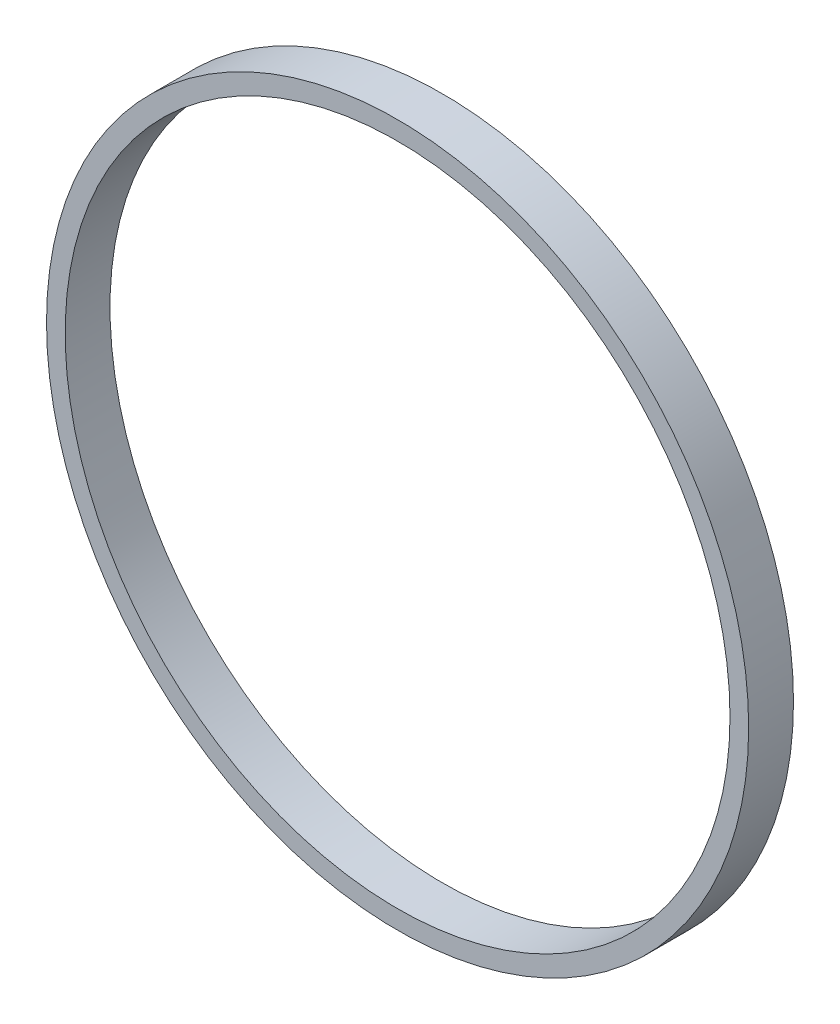
ISO-10303-21;
HEADER;
FILE_DESCRIPTION(('STEP AP214'),'2;1');
FILE_NAME('part.step','',(''),(''),'','','');
FILE_SCHEMA(('AUTOMOTIVE_DESIGN { 1 0 10303 214 1 1 1 1 }'));
ENDSEC;
DATA;
#1=APPLICATION_CONTEXT('core data for automotive mechanical design processes');
#2=APPLICATION_PROTOCOL_DEFINITION('international standard','automotive_design',2000,#1);
#3=PRODUCT_CONTEXT('',#1,'mechanical');
#4=PRODUCT('Part','Part','',(#3));
#5=PRODUCT_RELATED_PRODUCT_CATEGORY('part','',(#4));
#6=PRODUCT_DEFINITION_FORMATION('','',#4);
#7=PRODUCT_DEFINITION_CONTEXT('part definition',#1,'design');
#8=PRODUCT_DEFINITION('design','',#6,#7);
#9=PRODUCT_DEFINITION_SHAPE('','',#8);
#10=(LENGTH_UNIT() NAMED_UNIT(*) SI_UNIT(.MILLI.,.METRE.));
#11=(NAMED_UNIT(*) PLANE_ANGLE_UNIT() SI_UNIT($,.RADIAN.));
#12=(NAMED_UNIT(*) SI_UNIT($,.STERADIAN.) SOLID_ANGLE_UNIT());
#13=UNCERTAINTY_MEASURE_WITH_UNIT(LENGTH_MEASURE(1.E-05),#10,'distance_accuracy_value','');
#14=(GEOMETRIC_REPRESENTATION_CONTEXT(3) GLOBAL_UNCERTAINTY_ASSIGNED_CONTEXT((#13)) GLOBAL_UNIT_ASSIGNED_CONTEXT((#10,
#11,#12)) REPRESENTATION_CONTEXT('',''));
#15=CARTESIAN_POINT('',(0.,0.,0.));
#16=DIRECTION('',(0.,0.,1.));
#17=DIRECTION('',(1.,0.,0.));
#18=AXIS2_PLACEMENT_3D('',#15,#16,#17);
#19=CARTESIAN_POINT('',(0.,0.,3.));
#20=DIRECTION('',(0.,0.,1.));
#21=DIRECTION('',(1.,0.,0.));
#22=AXIS2_PLACEMENT_3D('',#19,#20,#21);
#23=PLANE('',#22);
#24=CARTESIAN_POINT('',(0.,0.,3.));
#25=DIRECTION('',(0.,0.,1.));
#26=DIRECTION('',(1.,0.,0.));
#27=AXIS2_PLACEMENT_3D('',#24,#25,#26);
#28=CIRCLE('',#27,23.5);
#29=CARTESIAN_POINT('',(23.5,0.,3.));
#30=VERTEX_POINT('',#29);
#31=EDGE_CURVE('E10',#30,#30,#28,.T.);
#32=ORIENTED_EDGE('',*,*,#31,.T.);
#33=EDGE_LOOP('',(#32));
#34=FACE_BOUND('',#33,.T.);
#35=CARTESIAN_POINT('',(0.,0.,3.));
#36=DIRECTION('',(0.,0.,1.));
#37=DIRECTION('',(1.,0.,0.));
#38=AXIS2_PLACEMENT_3D('',#35,#36,#37);
#39=CIRCLE('',#38,22.25);
#40=CARTESIAN_POINT('',(22.25,0.,3.));
#41=VERTEX_POINT('',#40);
#42=EDGE_CURVE('E42',#41,#41,#39,.T.);
#43=ORIENTED_EDGE('',*,*,#42,.F.);
#44=EDGE_LOOP('',(#43));
#45=FACE_BOUND('',#44,.T.);
#46=ADVANCED_FACE('F31',(#34,#45),#23,.T.);
#47=CARTESIAN_POINT('',(0.,0.,0.));
#48=DIRECTION('',(0.,0.,1.));
#49=DIRECTION('',(1.,0.,0.));
#50=AXIS2_PLACEMENT_3D('',#47,#48,#49);
#51=PLANE('',#50);
#52=CARTESIAN_POINT('',(0.,0.,0.));
#53=DIRECTION('',(0.,0.,1.));
#54=DIRECTION('',(1.,0.,0.));
#55=AXIS2_PLACEMENT_3D('',#52,#53,#54);
#56=CIRCLE('',#55,23.5);
#57=CARTESIAN_POINT('',(23.5,0.,0.));
#58=VERTEX_POINT('',#57);
#59=EDGE_CURVE('E35',#58,#58,#56,.T.);
#60=ORIENTED_EDGE('',*,*,#59,.F.);
#61=EDGE_LOOP('',(#60));
#62=FACE_BOUND('',#61,.T.);
#63=CARTESIAN_POINT('',(0.,0.,0.));
#64=DIRECTION('',(0.,0.,1.));
#65=DIRECTION('',(1.,0.,0.));
#66=AXIS2_PLACEMENT_3D('',#63,#64,#65);
#67=CIRCLE('',#66,22.25);
#68=CARTESIAN_POINT('',(22.25,0.,0.));
#69=VERTEX_POINT('',#68);
#70=EDGE_CURVE('E44',#69,#69,#67,.T.);
#71=ORIENTED_EDGE('',*,*,#70,.T.);
#72=EDGE_LOOP('',(#71));
#73=FACE_BOUND('',#72,.T.);
#74=ADVANCED_FACE('F54',(#62,#73),#51,.F.);
#75=CARTESIAN_POINT('',(0.,0.,3.));
#76=DIRECTION('',(0.,0.,-1.));
#77=DIRECTION('',(-1.,0.,0.));
#78=AXIS2_PLACEMENT_3D('',#75,#76,#77);
#79=CYLINDRICAL_SURFACE('',#78,23.5);
#80=ORIENTED_EDGE('',*,*,#31,.F.);
#81=EDGE_LOOP('',(#80));
#82=FACE_BOUND('',#81,.T.);
#83=ORIENTED_EDGE('',*,*,#59,.T.);
#84=EDGE_LOOP('',(#83));
#85=FACE_BOUND('',#84,.T.);
#86=ADVANCED_FACE('F33',(#82,#85),#79,.T.);
#87=CARTESIAN_POINT('',(0.,0.,3.));
#88=DIRECTION('',(0.,0.,-1.));
#89=DIRECTION('',(-1.,0.,0.));
#90=AXIS2_PLACEMENT_3D('',#87,#88,#89);
#91=CYLINDRICAL_SURFACE('',#90,22.25);
#92=ORIENTED_EDGE('',*,*,#42,.T.);
#93=EDGE_LOOP('',(#92));
#94=FACE_BOUND('',#93,.T.);
#95=ORIENTED_EDGE('',*,*,#70,.F.);
#96=EDGE_LOOP('',(#95));
#97=FACE_BOUND('',#96,.T.);
#98=ADVANCED_FACE('F50',(#94,#97),#91,.F.);
#99=CLOSED_SHELL('',(#46,#74,#86,#98));
#100=MANIFOLD_SOLID_BREP('B2',#99);
#101=ADVANCED_BREP_SHAPE_REPRESENTATION('',(#18,#100),#14);
#102=SHAPE_DEFINITION_REPRESENTATION(#9,#101);
ENDSEC;
END-ISO-10303-21;
